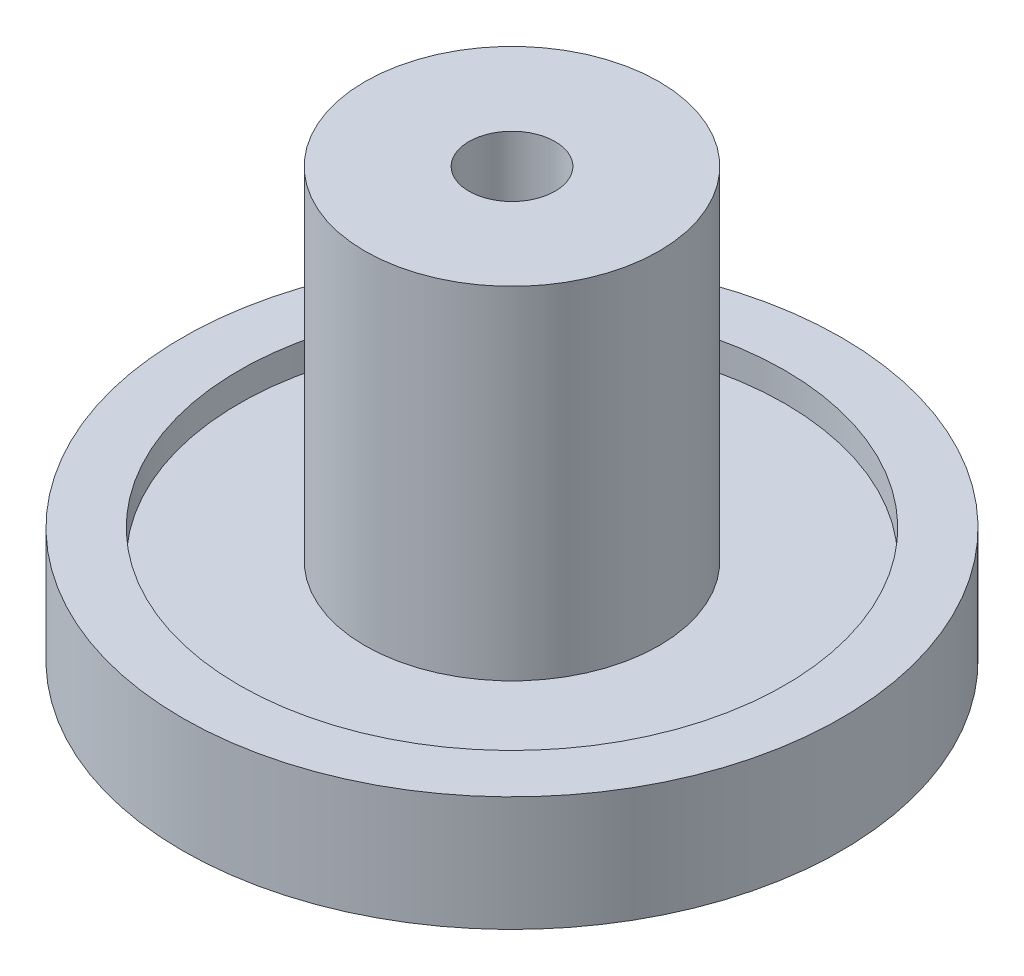
ISO-10303-21;
HEADER;
FILE_DESCRIPTION(('STEP AP214'),'2;1');
FILE_NAME('part.step','',(''),(''),'','','');
FILE_SCHEMA(('AUTOMOTIVE_DESIGN { 1 0 10303 214 1 1 1 1 }'));
ENDSEC;
DATA;
#1=APPLICATION_CONTEXT('core data for automotive mechanical design processes');
#2=APPLICATION_PROTOCOL_DEFINITION('international standard','automotive_design',2000,#1);
#3=PRODUCT_CONTEXT('',#1,'mechanical');
#4=PRODUCT('Part','Part','',(#3));
#5=PRODUCT_RELATED_PRODUCT_CATEGORY('part','',(#4));
#6=PRODUCT_DEFINITION_FORMATION('','',#4);
#7=PRODUCT_DEFINITION_CONTEXT('part definition',#1,'design');
#8=PRODUCT_DEFINITION('design','',#6,#7);
#9=PRODUCT_DEFINITION_SHAPE('','',#8);
#10=(LENGTH_UNIT() NAMED_UNIT(*) SI_UNIT(.MILLI.,.METRE.));
#11=(NAMED_UNIT(*) PLANE_ANGLE_UNIT() SI_UNIT($,.RADIAN.));
#12=(NAMED_UNIT(*) SI_UNIT($,.STERADIAN.) SOLID_ANGLE_UNIT());
#13=UNCERTAINTY_MEASURE_WITH_UNIT(LENGTH_MEASURE(1.E-05),#10,'distance_accuracy_value','');
#14=(GEOMETRIC_REPRESENTATION_CONTEXT(3) GLOBAL_UNCERTAINTY_ASSIGNED_CONTEXT((#13)) GLOBAL_UNIT_ASSIGNED_CONTEXT((#10,
#11,#12)) REPRESENTATION_CONTEXT('',''));
#15=CARTESIAN_POINT('',(0.,0.,0.));
#16=DIRECTION('',(0.,0.,1.));
#17=DIRECTION('',(1.,0.,0.));
#18=AXIS2_PLACEMENT_3D('',#15,#16,#17);
#19=CARTESIAN_POINT('',(5.1181,14.9,0.));
#20=DIRECTION('',(0.,1.,0.));
#21=DIRECTION('',(0.,0.,1.));
#22=AXIS2_PLACEMENT_3D('',#19,#20,#21);
#23=PLANE('',#22);
#24=CARTESIAN_POINT('',(0.,14.9,0.));
#25=DIRECTION('',(0.,-1.,0.));
#26=DIRECTION('',(0.,0.,-1.));
#27=AXIS2_PLACEMENT_3D('',#24,#25,#26);
#28=CIRCLE('',#27,1.50000000000001);
#29=CARTESIAN_POINT('',(0.,14.9,-1.50000000000001));
#30=VERTEX_POINT('',#29);
#31=EDGE_CURVE('E10',#30,#30,#28,.T.);
#32=ORIENTED_EDGE('',*,*,#31,.T.);
#33=EDGE_LOOP('',(#32));
#34=FACE_BOUND('',#33,.T.);
#35=CARTESIAN_POINT('',(0.,14.9,0.));
#36=DIRECTION('',(0.,-1.,0.));
#37=DIRECTION('',(0.,0.,-1.));
#38=AXIS2_PLACEMENT_3D('',#35,#36,#37);
#39=CIRCLE('',#38,5.1181);
#40=CARTESIAN_POINT('',(0.,14.9,-5.1181));
#41=VERTEX_POINT('',#40);
#42=EDGE_CURVE('E74',#41,#41,#39,.T.);
#43=ORIENTED_EDGE('',*,*,#42,.F.);
#44=EDGE_LOOP('',(#43));
#45=FACE_BOUND('',#44,.T.);
#46=ADVANCED_FACE('F34',(#34,#45),#23,.T.);
#47=CARTESIAN_POINT('',(0.,0.,0.));
#48=DIRECTION('',(0.,-1.,0.));
#49=DIRECTION('',(0.,0.,-1.));
#50=AXIS2_PLACEMENT_3D('',#47,#48,#49);
#51=CYLINDRICAL_SURFACE('',#50,1.50000000000001);
#52=CARTESIAN_POINT('',(0.,0.,0.));
#53=DIRECTION('',(0.,-1.,0.));
#54=DIRECTION('',(0.,0.,-1.));
#55=AXIS2_PLACEMENT_3D('',#52,#53,#54);
#56=CIRCLE('',#55,1.50000000000001);
#57=CARTESIAN_POINT('',(0.,0.,-1.50000000000001));
#58=VERTEX_POINT('',#57);
#59=EDGE_CURVE('E40',#58,#58,#56,.T.);
#60=ORIENTED_EDGE('',*,*,#59,.T.);
#61=EDGE_LOOP('',(#60));
#62=FACE_BOUND('',#61,.T.);
#63=ORIENTED_EDGE('',*,*,#31,.F.);
#64=EDGE_LOOP('',(#63));
#65=FACE_BOUND('',#64,.T.);
#66=ADVANCED_FACE('F82',(#62,#65),#51,.F.);
#67=CARTESIAN_POINT('',(1.50000000000001,0.,0.));
#68=DIRECTION('',(0.,-1.,0.));
#69=DIRECTION('',(0.,0.,-1.));
#70=AXIS2_PLACEMENT_3D('',#67,#68,#69);
#71=PLANE('',#70);
#72=CARTESIAN_POINT('',(0.,0.,0.));
#73=DIRECTION('',(0.,-1.,0.));
#74=DIRECTION('',(0.,0.,-1.));
#75=AXIS2_PLACEMENT_3D('',#72,#73,#74);
#76=CIRCLE('',#75,3.5);
#77=CARTESIAN_POINT('',(0.,0.,-3.5));
#78=VERTEX_POINT('',#77);
#79=EDGE_CURVE('E44',#78,#78,#76,.T.);
#80=ORIENTED_EDGE('',*,*,#79,.T.);
#81=EDGE_LOOP('',(#80));
#82=FACE_BOUND('',#81,.T.);
#83=ORIENTED_EDGE('',*,*,#59,.F.);
#84=EDGE_LOOP('',(#83));
#85=FACE_BOUND('',#84,.T.);
#86=ADVANCED_FACE('F86',(#82,#85),#71,.T.);
#87=CARTESIAN_POINT('',(0.,0.,0.));
#88=DIRECTION('',(0.,-1.,0.));
#89=DIRECTION('',(0.,0.,-1.));
#90=AXIS2_PLACEMENT_3D('',#87,#88,#89);
#91=CYLINDRICAL_SURFACE('',#90,3.5);
#92=CARTESIAN_POINT('',(0.,1.2,0.));
#93=DIRECTION('',(0.,-1.,0.));
#94=DIRECTION('',(0.,0.,-1.));
#95=AXIS2_PLACEMENT_3D('',#92,#93,#94);
#96=CIRCLE('',#95,3.5);
#97=CARTESIAN_POINT('',(0.,1.2,-3.5));
#98=VERTEX_POINT('',#97);
#99=EDGE_CURVE('E48',#98,#98,#96,.T.);
#100=ORIENTED_EDGE('',*,*,#99,.T.);
#101=EDGE_LOOP('',(#100));
#102=FACE_BOUND('',#101,.T.);
#103=ORIENTED_EDGE('',*,*,#79,.F.);
#104=EDGE_LOOP('',(#103));
#105=FACE_BOUND('',#104,.T.);
#106=ADVANCED_FACE('F90',(#102,#105),#91,.T.);
#107=CARTESIAN_POINT('',(3.5,1.2,0.));
#108=DIRECTION('',(0.,-1.,0.));
#109=DIRECTION('',(0.,0.,-1.));
#110=AXIS2_PLACEMENT_3D('',#107,#108,#109);
#111=PLANE('',#110);
#112=CARTESIAN_POINT('',(0.,1.2,0.));
#113=DIRECTION('',(0.,-1.,0.));
#114=DIRECTION('',(0.,0.,-1.));
#115=AXIS2_PLACEMENT_3D('',#112,#113,#114);
#116=CIRCLE('',#115,9.5);
#117=CARTESIAN_POINT('',(0.,1.2,-9.5));
#118=VERTEX_POINT('',#117);
#119=EDGE_CURVE('E53',#118,#118,#116,.T.);
#120=ORIENTED_EDGE('',*,*,#119,.T.);
#121=EDGE_LOOP('',(#120));
#122=FACE_BOUND('',#121,.T.);
#123=ORIENTED_EDGE('',*,*,#99,.F.);
#124=EDGE_LOOP('',(#123));
#125=FACE_BOUND('',#124,.T.);
#126=ADVANCED_FACE('F97',(#122,#125),#111,.T.);
#127=CARTESIAN_POINT('',(0.,0.,0.));
#128=DIRECTION('',(0.,-1.,0.));
#129=DIRECTION('',(0.,0.,-1.));
#130=AXIS2_PLACEMENT_3D('',#127,#128,#129);
#131=CYLINDRICAL_SURFACE('',#130,9.5);
#132=CARTESIAN_POINT('',(0.,0.,0.));
#133=DIRECTION('',(0.,-1.,0.));
#134=DIRECTION('',(0.,0.,-1.));
#135=AXIS2_PLACEMENT_3D('',#132,#133,#134);
#136=CIRCLE('',#135,9.5);
#137=CARTESIAN_POINT('',(0.,0.,-9.5));
#138=VERTEX_POINT('',#137);
#139=EDGE_CURVE('E56',#138,#138,#136,.T.);
#140=ORIENTED_EDGE('',*,*,#139,.T.);
#141=EDGE_LOOP('',(#140));
#142=FACE_BOUND('',#141,.T.);
#143=ORIENTED_EDGE('',*,*,#119,.F.);
#144=EDGE_LOOP('',(#143));
#145=FACE_BOUND('',#144,.T.);
#146=ADVANCED_FACE('F101',(#142,#145),#131,.F.);
#147=CARTESIAN_POINT('',(9.5,0.,0.));
#148=DIRECTION('',(0.,-1.,0.));
#149=DIRECTION('',(0.,0.,-1.));
#150=AXIS2_PLACEMENT_3D('',#147,#148,#149);
#151=PLANE('',#150);
#152=CARTESIAN_POINT('',(0.,0.,0.));
#153=DIRECTION('',(0.,-1.,0.));
#154=DIRECTION('',(0.,0.,-1.));
#155=AXIS2_PLACEMENT_3D('',#152,#153,#154);
#156=CIRCLE('',#155,11.477625);
#157=CARTESIAN_POINT('',(0.,0.,-11.477625));
#158=VERTEX_POINT('',#157);
#159=EDGE_CURVE('E59',#158,#158,#156,.T.);
#160=ORIENTED_EDGE('',*,*,#159,.T.);
#161=EDGE_LOOP('',(#160));
#162=FACE_BOUND('',#161,.T.);
#163=ORIENTED_EDGE('',*,*,#139,.F.);
#164=EDGE_LOOP('',(#163));
#165=FACE_BOUND('',#164,.T.);
#166=ADVANCED_FACE('F105',(#162,#165),#151,.T.);
#167=CARTESIAN_POINT('',(0.,0.,0.));
#168=DIRECTION('',(0.,-1.,0.));
#169=DIRECTION('',(0.,0.,-1.));
#170=AXIS2_PLACEMENT_3D('',#167,#168,#169);
#171=CYLINDRICAL_SURFACE('',#170,11.477625);
#172=CARTESIAN_POINT('',(0.,4.,0.));
#173=DIRECTION('',(0.,-1.,0.));
#174=DIRECTION('',(0.,0.,-1.));
#175=AXIS2_PLACEMENT_3D('',#172,#173,#174);
#176=CIRCLE('',#175,11.477625);
#177=CARTESIAN_POINT('',(0.,4.,-11.477625));
#178=VERTEX_POINT('',#177);
#179=EDGE_CURVE('E62',#178,#178,#176,.T.);
#180=ORIENTED_EDGE('',*,*,#179,.T.);
#181=EDGE_LOOP('',(#180));
#182=FACE_BOUND('',#181,.T.);
#183=ORIENTED_EDGE('',*,*,#159,.F.);
#184=EDGE_LOOP('',(#183));
#185=FACE_BOUND('',#184,.T.);
#186=ADVANCED_FACE('F109',(#182,#185),#171,.T.);
#187=CARTESIAN_POINT('',(11.477625,4.,0.));
#188=DIRECTION('',(0.,1.,0.));
#189=DIRECTION('',(0.,0.,1.));
#190=AXIS2_PLACEMENT_3D('',#187,#188,#189);
#191=PLANE('',#190);
#192=CARTESIAN_POINT('',(0.,4.,0.));
#193=DIRECTION('',(0.,-1.,0.));
#194=DIRECTION('',(0.,0.,-1.));
#195=AXIS2_PLACEMENT_3D('',#192,#193,#194);
#196=CIRCLE('',#195,9.5);
#197=CARTESIAN_POINT('',(0.,4.,-9.5));
#198=VERTEX_POINT('',#197);
#199=EDGE_CURVE('E65',#198,#198,#196,.T.);
#200=ORIENTED_EDGE('',*,*,#199,.T.);
#201=EDGE_LOOP('',(#200));
#202=FACE_BOUND('',#201,.T.);
#203=ORIENTED_EDGE('',*,*,#179,.F.);
#204=EDGE_LOOP('',(#203));
#205=FACE_BOUND('',#204,.T.);
#206=ADVANCED_FACE('F113',(#202,#205),#191,.T.);
#207=CARTESIAN_POINT('',(0.,0.,0.));
#208=DIRECTION('',(0.,-1.,0.));
#209=DIRECTION('',(0.,0.,-1.));
#210=AXIS2_PLACEMENT_3D('',#207,#208,#209);
#211=CYLINDRICAL_SURFACE('',#210,9.5);
#212=CARTESIAN_POINT('',(0.,3.,0.));
#213=DIRECTION('',(0.,-1.,0.));
#214=DIRECTION('',(0.,0.,-1.));
#215=AXIS2_PLACEMENT_3D('',#212,#213,#214);
#216=CIRCLE('',#215,9.5);
#217=CARTESIAN_POINT('',(0.,3.,-9.5));
#218=VERTEX_POINT('',#217);
#219=EDGE_CURVE('E68',#218,#218,#216,.T.);
#220=ORIENTED_EDGE('',*,*,#219,.T.);
#221=EDGE_LOOP('',(#220));
#222=FACE_BOUND('',#221,.T.);
#223=ORIENTED_EDGE('',*,*,#199,.F.);
#224=EDGE_LOOP('',(#223));
#225=FACE_BOUND('',#224,.T.);
#226=ADVANCED_FACE('F117',(#222,#225),#211,.F.);
#227=CARTESIAN_POINT('',(9.5,3.,0.));
#228=DIRECTION('',(0.,1.,0.));
#229=DIRECTION('',(0.,0.,1.));
#230=AXIS2_PLACEMENT_3D('',#227,#228,#229);
#231=PLANE('',#230);
#232=CARTESIAN_POINT('',(0.,3.,0.));
#233=DIRECTION('',(0.,-1.,0.));
#234=DIRECTION('',(0.,0.,-1.));
#235=AXIS2_PLACEMENT_3D('',#232,#233,#234);
#236=CIRCLE('',#235,5.1181);
#237=CARTESIAN_POINT('',(0.,3.,-5.1181));
#238=VERTEX_POINT('',#237);
#239=EDGE_CURVE('E71',#238,#238,#236,.T.);
#240=ORIENTED_EDGE('',*,*,#239,.T.);
#241=EDGE_LOOP('',(#240));
#242=FACE_BOUND('',#241,.T.);
#243=ORIENTED_EDGE('',*,*,#219,.F.);
#244=EDGE_LOOP('',(#243));
#245=FACE_BOUND('',#244,.T.);
#246=ADVANCED_FACE('F121',(#242,#245),#231,.T.);
#247=CARTESIAN_POINT('',(0.,0.,0.));
#248=DIRECTION('',(0.,-1.,0.));
#249=DIRECTION('',(0.,0.,-1.));
#250=AXIS2_PLACEMENT_3D('',#247,#248,#249);
#251=CYLINDRICAL_SURFACE('',#250,5.1181);
#252=ORIENTED_EDGE('',*,*,#42,.T.);
#253=EDGE_LOOP('',(#252));
#254=FACE_BOUND('',#253,.T.);
#255=ORIENTED_EDGE('',*,*,#239,.F.);
#256=EDGE_LOOP('',(#255));
#257=FACE_BOUND('',#256,.T.);
#258=ADVANCED_FACE('F78',(#254,#257),#251,.T.);
#259=CLOSED_SHELL('',(#46,#66,#86,#106,#126,#146,#166,#186,#206,#226,#246,#258));
#260=MANIFOLD_SOLID_BREP('B2',#259);
#261=ADVANCED_BREP_SHAPE_REPRESENTATION('',(#18,#260),#14);
#262=SHAPE_DEFINITION_REPRESENTATION(#9,#261);
ENDSEC;
END-ISO-10303-21;
